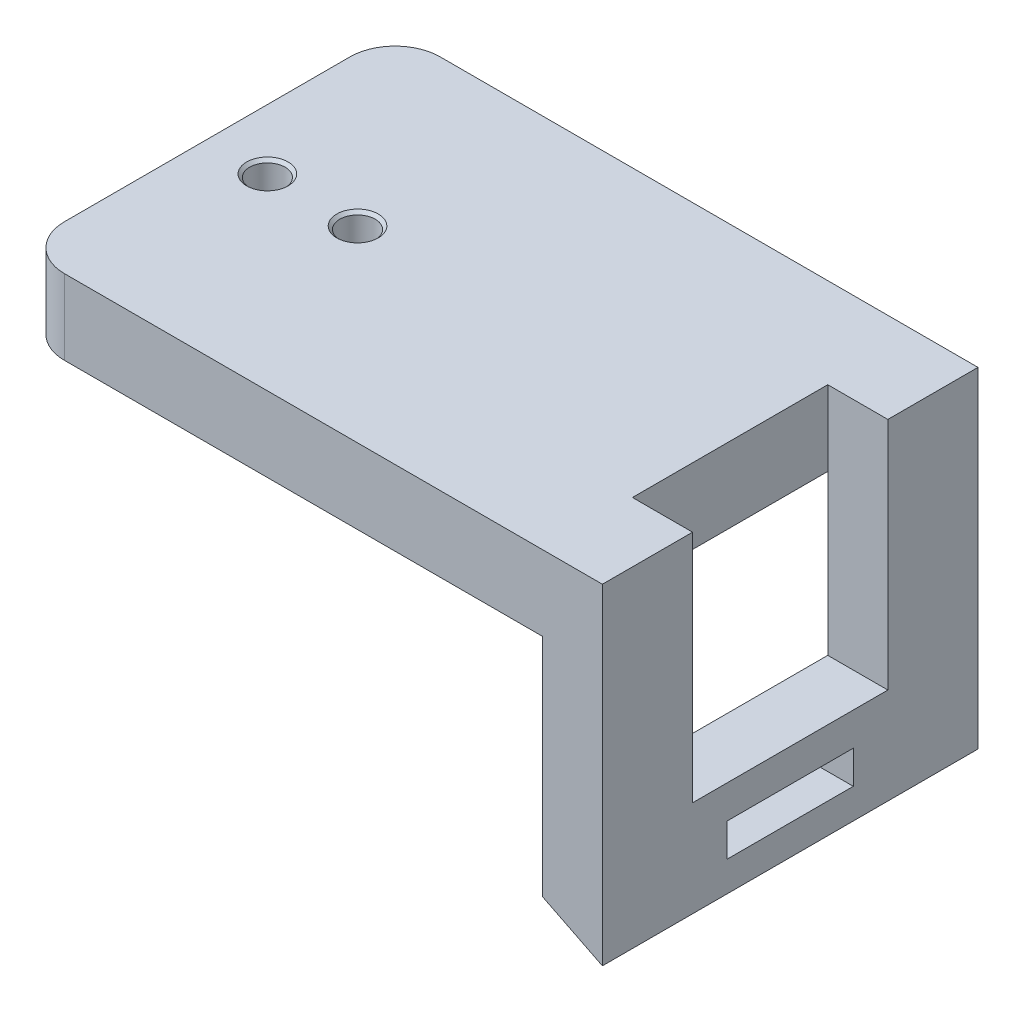
ISO-10303-21;
HEADER;
FILE_DESCRIPTION(('STEP AP214'),'2;1');
FILE_NAME('part.step','',(''),(''),'','','');
FILE_SCHEMA(('AUTOMOTIVE_DESIGN { 1 0 10303 214 1 1 1 1 }'));
ENDSEC;
DATA;
#1=APPLICATION_CONTEXT('core data for automotive mechanical design processes');
#2=APPLICATION_PROTOCOL_DEFINITION('international standard','automotive_design',2000,#1);
#3=PRODUCT_CONTEXT('',#1,'mechanical');
#4=PRODUCT('Part','Part','',(#3));
#5=PRODUCT_RELATED_PRODUCT_CATEGORY('part','',(#4));
#6=PRODUCT_DEFINITION_FORMATION('','',#4);
#7=PRODUCT_DEFINITION_CONTEXT('part definition',#1,'design');
#8=PRODUCT_DEFINITION('design','',#6,#7);
#9=PRODUCT_DEFINITION_SHAPE('','',#8);
#10=(LENGTH_UNIT() NAMED_UNIT(*) SI_UNIT(.MILLI.,.METRE.));
#11=(NAMED_UNIT(*) PLANE_ANGLE_UNIT() SI_UNIT($,.RADIAN.));
#12=(NAMED_UNIT(*) SI_UNIT($,.STERADIAN.) SOLID_ANGLE_UNIT());
#13=UNCERTAINTY_MEASURE_WITH_UNIT(LENGTH_MEASURE(1.E-05),#10,'distance_accuracy_value','');
#14=(GEOMETRIC_REPRESENTATION_CONTEXT(3) GLOBAL_UNCERTAINTY_ASSIGNED_CONTEXT((#13)) GLOBAL_UNIT_ASSIGNED_CONTEXT((#10,
#11,#12)) REPRESENTATION_CONTEXT('',''));
#15=CARTESIAN_POINT('',(0.,0.,0.));
#16=DIRECTION('',(0.,0.,1.));
#17=DIRECTION('',(1.,0.,0.));
#18=AXIS2_PLACEMENT_3D('',#15,#16,#17);
#19=CARTESIAN_POINT('',(44.196,6.35,0.));
#20=DIRECTION('',(-1.,0.,0.));
#21=DIRECTION('',(0.,0.,1.));
#22=AXIS2_PLACEMENT_3D('',#19,#20,#21);
#23=PLANE('',#22);
#24=DIRECTION('',(0.,1.,0.));
#25=VECTOR('',#24,1.);
#26=CARTESIAN_POINT('',(44.196,6.35,-7.62));
#27=LINE('',#26,#25);
#28=CARTESIAN_POINT('',(44.196,0.,-7.62));
#29=VERTEX_POINT('',#28);
#30=CARTESIAN_POINT('',(44.196,6.35,-7.62));
#31=VERTEX_POINT('',#30);
#32=EDGE_CURVE('E11',#29,#31,#27,.T.);
#33=ORIENTED_EDGE('',*,*,#32,.F.);
#34=DIRECTION('',(0.,0.,-1.));
#35=VECTOR('',#34,1.);
#36=CARTESIAN_POINT('',(44.196,0.,0.));
#37=LINE('',#36,#35);
#38=CARTESIAN_POINT('',(44.196,0.,-24.13));
#39=VERTEX_POINT('',#38);
#40=EDGE_CURVE('E298',#29,#39,#37,.T.);
#41=ORIENTED_EDGE('',*,*,#40,.T.);
#42=DIRECTION('',(0.,-1.,0.));
#43=VECTOR('',#42,1.);
#44=CARTESIAN_POINT('',(44.196,-11.43,-24.13));
#45=LINE('',#44,#43);
#46=CARTESIAN_POINT('',(44.196,6.35,-24.13));
#47=VERTEX_POINT('',#46);
#48=EDGE_CURVE('E57',#47,#39,#45,.T.);
#49=ORIENTED_EDGE('',*,*,#48,.F.);
#50=DIRECTION('',(0.,0.,-1.));
#51=VECTOR('',#50,1.);
#52=CARTESIAN_POINT('',(44.196,6.35,0.));
#53=LINE('',#52,#51);
#54=EDGE_CURVE('E263',#31,#47,#53,.T.);
#55=ORIENTED_EDGE('',*,*,#54,.F.);
#56=EDGE_LOOP('',(#33,#41,#49,#55));
#57=FACE_BOUND('',#56,.T.);
#58=ADVANCED_FACE('F33',(#57),#23,.F.);
#59=CARTESIAN_POINT('',(0.,6.35,0.));
#60=DIRECTION('',(1.,0.,0.));
#61=DIRECTION('',(0.,0.,-1.));
#62=AXIS2_PLACEMENT_3D('',#59,#60,#61);
#63=PLANE('',#62);
#64=DIRECTION('',(0.,0.,1.));
#65=VECTOR('',#64,1.);
#66=CARTESIAN_POINT('',(0.,0.,0.));
#67=LINE('',#66,#65);
#68=CARTESIAN_POINT('',(0.,0.,-27.94));
#69=VERTEX_POINT('',#68);
#70=CARTESIAN_POINT('',(0.,0.,-3.81));
#71=VERTEX_POINT('',#70);
#72=EDGE_CURVE('E302',#69,#71,#67,.T.);
#73=ORIENTED_EDGE('',*,*,#72,.T.);
#74=DIRECTION('',(0.,-1.,0.));
#75=VECTOR('',#74,1.);
#76=CARTESIAN_POINT('',(0.,6.35,-3.81));
#77=LINE('',#76,#75);
#78=CARTESIAN_POINT('',(0.,6.35,-3.81));
#79=VERTEX_POINT('',#78);
#80=EDGE_CURVE('E328',#71,#79,#77,.F.);
#81=ORIENTED_EDGE('',*,*,#80,.T.);
#82=DIRECTION('',(0.,0.,1.));
#83=VECTOR('',#82,1.);
#84=CARTESIAN_POINT('',(0.,6.35,0.));
#85=LINE('',#84,#83);
#86=CARTESIAN_POINT('',(0.,6.35,-27.94));
#87=VERTEX_POINT('',#86);
#88=EDGE_CURVE('E257',#87,#79,#85,.T.);
#89=ORIENTED_EDGE('',*,*,#88,.F.);
#90=DIRECTION('',(0.,-1.,0.));
#91=VECTOR('',#90,1.);
#92=CARTESIAN_POINT('',(0.,6.35,-27.94));
#93=LINE('',#92,#91);
#94=EDGE_CURVE('E330',#87,#69,#93,.T.);
#95=ORIENTED_EDGE('',*,*,#94,.T.);
#96=EDGE_LOOP('',(#73,#81,#89,#95));
#97=FACE_BOUND('',#96,.T.);
#98=ADVANCED_FACE('F326',(#97),#63,.F.);
#99=CARTESIAN_POINT('',(0.,6.35,0.));
#100=DIRECTION('',(0.,0.,-1.));
#101=DIRECTION('',(-1.,0.,0.));
#102=AXIS2_PLACEMENT_3D('',#99,#100,#101);
#103=PLANE('',#102);
#104=DIRECTION('',(0.,-1.,0.));
#105=VECTOR('',#104,1.);
#106=CARTESIAN_POINT('',(44.196,6.35,0.));
#107=LINE('',#106,#105);
#108=CARTESIAN_POINT('',(44.196,0.,0.));
#109=VERTEX_POINT('',#108);
#110=CARTESIAN_POINT('',(44.196,-19.05,0.));
#111=VERTEX_POINT('',#110);
#112=EDGE_CURVE('E241',#109,#111,#107,.T.);
#113=ORIENTED_EDGE('',*,*,#112,.T.);
#114=DIRECTION('',(0.894427190999916,-0.447213595499958,0.));
#115=VECTOR('',#114,1.);
#116=CARTESIAN_POINT('',(-1.3208,3.7084,0.));
#117=LINE('',#116,#115);
#118=CARTESIAN_POINT('',(49.276,-21.59,2.5E-06));
#119=VERTEX_POINT('',#118);
#120=EDGE_CURVE('E186',#111,#119,#117,.T.);
#121=ORIENTED_EDGE('',*,*,#120,.T.);
#122=DIRECTION('',(0.,-1.,0.));
#123=VECTOR('',#122,1.);
#124=CARTESIAN_POINT('',(49.276,6.35,0.));
#125=LINE('',#124,#123);
#126=CARTESIAN_POINT('',(49.276,6.35,0.));
#127=VERTEX_POINT('',#126);
#128=EDGE_CURVE('E198',#127,#119,#125,.T.);
#129=ORIENTED_EDGE('',*,*,#128,.F.);
#130=DIRECTION('',(1.,0.,0.));
#131=VECTOR('',#130,1.);
#132=CARTESIAN_POINT('',(0.,6.35,0.));
#133=LINE('',#132,#131);
#134=CARTESIAN_POINT('',(3.81,6.35,0.));
#135=VERTEX_POINT('',#134);
#136=EDGE_CURVE('E260',#135,#127,#133,.T.);
#137=ORIENTED_EDGE('',*,*,#136,.F.);
#138=DIRECTION('',(0.,-1.,0.));
#139=VECTOR('',#138,1.);
#140=CARTESIAN_POINT('',(3.81,6.35,0.));
#141=LINE('',#140,#139);
#142=CARTESIAN_POINT('',(3.81,0.,0.));
#143=VERTEX_POINT('',#142);
#144=EDGE_CURVE('E348',#135,#143,#141,.T.);
#145=ORIENTED_EDGE('',*,*,#144,.T.);
#146=DIRECTION('',(1.,0.,0.));
#147=VECTOR('',#146,1.);
#148=CARTESIAN_POINT('',(0.,0.,0.));
#149=LINE('',#148,#147);
#150=EDGE_CURVE('E299',#143,#109,#149,.T.);
#151=ORIENTED_EDGE('',*,*,#150,.T.);
#152=EDGE_LOOP('',(#113,#121,#129,#137,#145,#151));
#153=FACE_BOUND('',#152,.T.);
#154=ADVANCED_FACE('F399',(#153),#103,.F.);
#155=CARTESIAN_POINT('',(0.,6.35,-31.75));
#156=DIRECTION('',(0.,0.,1.));
#157=DIRECTION('',(1.,0.,0.));
#158=AXIS2_PLACEMENT_3D('',#155,#156,#157);
#159=PLANE('',#158);
#160=DIRECTION('',(0.,1.,0.));
#161=VECTOR('',#160,1.);
#162=CARTESIAN_POINT('',(49.276,6.35,-31.75));
#163=LINE('',#162,#161);
#164=CARTESIAN_POINT('',(49.276,-21.59,-31.75));
#165=VERTEX_POINT('',#164);
#166=CARTESIAN_POINT('',(49.276,6.35,-31.75));
#167=VERTEX_POINT('',#166);
#168=EDGE_CURVE('E201',#165,#167,#163,.T.);
#169=ORIENTED_EDGE('',*,*,#168,.F.);
#170=DIRECTION('',(0.894427190999916,-0.447213595499958,0.));
#171=VECTOR('',#170,1.);
#172=CARTESIAN_POINT('',(49.276,-21.59,-31.75));
#173=LINE('',#172,#171);
#174=CARTESIAN_POINT('',(44.196,-19.05,-31.75));
#175=VERTEX_POINT('',#174);
#176=EDGE_CURVE('E181',#175,#165,#173,.T.);
#177=ORIENTED_EDGE('',*,*,#176,.F.);
#178=DIRECTION('',(0.,1.,0.));
#179=VECTOR('',#178,1.);
#180=CARTESIAN_POINT('',(44.196,6.35,-31.75));
#181=LINE('',#180,#179);
#182=CARTESIAN_POINT('',(44.196,0.,-31.75));
#183=VERTEX_POINT('',#182);
#184=EDGE_CURVE('E195',#175,#183,#181,.T.);
#185=ORIENTED_EDGE('',*,*,#184,.T.);
#186=DIRECTION('',(-1.,0.,0.));
#187=VECTOR('',#186,1.);
#188=CARTESIAN_POINT('',(0.,0.,-31.75));
#189=LINE('',#188,#187);
#190=CARTESIAN_POINT('',(3.81,0.,-31.75));
#191=VERTEX_POINT('',#190);
#192=EDGE_CURVE('E261',#183,#191,#189,.T.);
#193=ORIENTED_EDGE('',*,*,#192,.T.);
#194=DIRECTION('',(0.,-1.,0.));
#195=VECTOR('',#194,1.);
#196=CARTESIAN_POINT('',(3.81,6.35,-31.75));
#197=LINE('',#196,#195);
#198=CARTESIAN_POINT('',(3.81,6.35,-31.75));
#199=VERTEX_POINT('',#198);
#200=EDGE_CURVE('E42',#191,#199,#197,.F.);
#201=ORIENTED_EDGE('',*,*,#200,.T.);
#202=DIRECTION('',(-1.,0.,0.));
#203=VECTOR('',#202,1.);
#204=CARTESIAN_POINT('',(0.,6.35,-31.75));
#205=LINE('',#204,#203);
#206=EDGE_CURVE('E266',#167,#199,#205,.T.);
#207=ORIENTED_EDGE('',*,*,#206,.F.);
#208=EDGE_LOOP('',(#169,#177,#185,#193,#201,#207));
#209=FACE_BOUND('',#208,.T.);
#210=ADVANCED_FACE('F282',(#209),#159,.F.);
#211=CARTESIAN_POINT('',(0.,6.35,0.));
#212=DIRECTION('',(0.,-1.,0.));
#213=DIRECTION('',(0.,0.,-1.));
#214=AXIS2_PLACEMENT_3D('',#211,#212,#213);
#215=PLANE('',#214);
#216=CARTESIAN_POINT('',(12.7,6.35,-15.875));
#217=DIRECTION('',(0.,-1.,0.));
#218=DIRECTION('',(0.,0.,-1.));
#219=AXIS2_PLACEMENT_3D('',#216,#217,#218);
#220=CIRCLE('',#219,1.75399999999999);
#221=CARTESIAN_POINT('',(12.7,6.35,-17.629));
#222=VERTEX_POINT('',#221);
#223=EDGE_CURVE('E350',#222,#222,#220,.T.);
#224=ORIENTED_EDGE('',*,*,#223,.T.);
#225=EDGE_LOOP('',(#224));
#226=FACE_BOUND('',#225,.T.);
#227=CARTESIAN_POINT('',(5.08,6.35,-15.875));
#228=DIRECTION('',(0.,-1.,0.));
#229=DIRECTION('',(0.,0.,-1.));
#230=AXIS2_PLACEMENT_3D('',#227,#228,#229);
#231=CIRCLE('',#230,1.754);
#232=CARTESIAN_POINT('',(5.08,6.35,-17.629));
#233=VERTEX_POINT('',#232);
#234=EDGE_CURVE('E355',#233,#233,#231,.T.);
#235=ORIENTED_EDGE('',*,*,#234,.T.);
#236=EDGE_LOOP('',(#235));
#237=FACE_BOUND('',#236,.T.);
#238=ORIENTED_EDGE('',*,*,#88,.T.);
#239=CARTESIAN_POINT('',(3.81,6.35,-3.81));
#240=DIRECTION('',(0.,-1.,0.));
#241=DIRECTION('',(0.,0.,-1.));
#242=AXIS2_PLACEMENT_3D('',#239,#240,#241);
#243=CIRCLE('',#242,3.81);
#244=EDGE_CURVE('E337',#79,#135,#243,.F.);
#245=ORIENTED_EDGE('',*,*,#244,.T.);
#246=ORIENTED_EDGE('',*,*,#136,.T.);
#247=DIRECTION('',(0.,0.,1.));
#248=VECTOR('',#247,1.);
#249=CARTESIAN_POINT('',(49.276,6.35,0.));
#250=LINE('',#249,#248);
#251=CARTESIAN_POINT('',(49.276,6.35,-7.62));
#252=VERTEX_POINT('',#251);
#253=EDGE_CURVE('E202',#252,#127,#250,.T.);
#254=ORIENTED_EDGE('',*,*,#253,.F.);
#255=DIRECTION('',(-1.,0.,0.));
#256=VECTOR('',#255,1.);
#257=CARTESIAN_POINT('',(49.276,6.35,-7.62));
#258=LINE('',#257,#256);
#259=EDGE_CURVE('E248',#252,#31,#258,.T.);
#260=ORIENTED_EDGE('',*,*,#259,.T.);
#261=ORIENTED_EDGE('',*,*,#54,.T.);
#262=DIRECTION('',(-1.,0.,0.));
#263=VECTOR('',#262,1.);
#264=CARTESIAN_POINT('',(49.276,6.35,-24.13));
#265=LINE('',#264,#263);
#266=CARTESIAN_POINT('',(49.276,6.35,-24.13));
#267=VERTEX_POINT('',#266);
#268=EDGE_CURVE('E273',#267,#47,#265,.T.);
#269=ORIENTED_EDGE('',*,*,#268,.F.);
#270=DIRECTION('',(0.,0.,1.));
#271=VECTOR('',#270,1.);
#272=CARTESIAN_POINT('',(49.276,6.35,-24.13));
#273=LINE('',#272,#271);
#274=EDGE_CURVE('E161',#167,#267,#273,.T.);
#275=ORIENTED_EDGE('',*,*,#274,.F.);
#276=ORIENTED_EDGE('',*,*,#206,.T.);
#277=CARTESIAN_POINT('',(3.81,6.35,-27.94));
#278=DIRECTION('',(0.,-1.,0.));
#279=DIRECTION('',(0.,0.,-1.));
#280=AXIS2_PLACEMENT_3D('',#277,#278,#279);
#281=CIRCLE('',#280,3.81);
#282=EDGE_CURVE('E338',#199,#87,#281,.F.);
#283=ORIENTED_EDGE('',*,*,#282,.T.);
#284=EDGE_LOOP('',(#238,#245,#246,#254,#260,#261,#269,#275,#276,#283));
#285=FACE_BOUND('',#284,.T.);
#286=ADVANCED_FACE('F347',(#226,#237,#285),#215,.F.);
#287=CARTESIAN_POINT('',(0.,0.,0.));
#288=DIRECTION('',(0.,-1.,0.));
#289=DIRECTION('',(0.,0.,-1.));
#290=AXIS2_PLACEMENT_3D('',#287,#288,#289);
#291=PLANE('',#290);
#292=CARTESIAN_POINT('',(5.08,0.,-15.875));
#293=DIRECTION('',(0.,-1.,0.));
#294=DIRECTION('',(0.,0.,-1.));
#295=AXIS2_PLACEMENT_3D('',#292,#293,#294);
#296=CIRCLE('',#295,1.754);
#297=CARTESIAN_POINT('',(5.08,0.,-17.629));
#298=VERTEX_POINT('',#297);
#299=EDGE_CURVE('E369',#298,#298,#296,.F.);
#300=ORIENTED_EDGE('',*,*,#299,.T.);
#301=EDGE_LOOP('',(#300));
#302=FACE_BOUND('',#301,.T.);
#303=CARTESIAN_POINT('',(12.7,0.,-15.875));
#304=DIRECTION('',(0.,-1.,0.));
#305=DIRECTION('',(0.,0.,-1.));
#306=AXIS2_PLACEMENT_3D('',#303,#304,#305);
#307=CIRCLE('',#306,1.754);
#308=CARTESIAN_POINT('',(12.7,0.,-17.629));
#309=VERTEX_POINT('',#308);
#310=EDGE_CURVE('E308',#309,#309,#307,.F.);
#311=ORIENTED_EDGE('',*,*,#310,.T.);
#312=EDGE_LOOP('',(#311));
#313=FACE_BOUND('',#312,.T.);
#314=ORIENTED_EDGE('',*,*,#150,.F.);
#315=CARTESIAN_POINT('',(3.81,0.,-3.81));
#316=DIRECTION('',(0.,-1.,0.));
#317=DIRECTION('',(0.,0.,-1.));
#318=AXIS2_PLACEMENT_3D('',#315,#316,#317);
#319=CIRCLE('',#318,3.81);
#320=EDGE_CURVE('E335',#143,#71,#319,.T.);
#321=ORIENTED_EDGE('',*,*,#320,.T.);
#322=ORIENTED_EDGE('',*,*,#72,.F.);
#323=CARTESIAN_POINT('',(3.81,0.,-27.94));
#324=DIRECTION('',(0.,-1.,0.));
#325=DIRECTION('',(0.,0.,-1.));
#326=AXIS2_PLACEMENT_3D('',#323,#324,#325);
#327=CIRCLE('',#326,3.81);
#328=EDGE_CURVE('E294',#69,#191,#327,.T.);
#329=ORIENTED_EDGE('',*,*,#328,.T.);
#330=ORIENTED_EDGE('',*,*,#192,.F.);
#331=EDGE_CURVE('E292',#39,#183,#37,.T.);
#332=ORIENTED_EDGE('',*,*,#331,.F.);
#333=ORIENTED_EDGE('',*,*,#40,.F.);
#334=EDGE_CURVE('E295',#109,#29,#37,.T.);
#335=ORIENTED_EDGE('',*,*,#334,.F.);
#336=EDGE_LOOP('',(#314,#321,#322,#329,#330,#332,#333,#335));
#337=FACE_BOUND('',#336,.T.);
#338=ADVANCED_FACE('F290',(#302,#313,#337),#291,.T.);
#339=CARTESIAN_POINT('',(12.7,6.35,-15.875));
#340=DIRECTION('',(0.,1.,0.));
#341=DIRECTION('',(0.,0.,1.));
#342=AXIS2_PLACEMENT_3D('',#339,#340,#341);
#343=CYLINDRICAL_SURFACE('',#342,1.49999999999999);
#344=CARTESIAN_POINT('',(12.7,0.254000000000004,-15.875));
#345=DIRECTION('',(0.,-1.,0.));
#346=DIRECTION('',(0.,0.,-1.));
#347=AXIS2_PLACEMENT_3D('',#344,#345,#346);
#348=CIRCLE('',#347,1.49999999999999);
#349=CARTESIAN_POINT('',(12.7,0.254000000000004,-17.375));
#350=VERTEX_POINT('',#349);
#351=EDGE_CURVE('E358',#350,#350,#348,.T.);
#352=ORIENTED_EDGE('',*,*,#351,.T.);
#353=EDGE_LOOP('',(#352));
#354=FACE_BOUND('',#353,.T.);
#355=CARTESIAN_POINT('',(12.7,6.096,-15.875));
#356=DIRECTION('',(0.,-1.,0.));
#357=DIRECTION('',(0.,0.,-1.));
#358=AXIS2_PLACEMENT_3D('',#355,#356,#357);
#359=CIRCLE('',#358,1.49999999999999);
#360=CARTESIAN_POINT('',(12.7,6.096,-17.375));
#361=VERTEX_POINT('',#360);
#362=EDGE_CURVE('E361',#361,#361,#359,.F.);
#363=ORIENTED_EDGE('',*,*,#362,.T.);
#364=EDGE_LOOP('',(#363));
#365=FACE_BOUND('',#364,.T.);
#366=ADVANCED_FACE('F444',(#354,#365),#343,.F.);
#367=CARTESIAN_POINT('',(5.08,6.35,-15.875));
#368=DIRECTION('',(0.,1.,0.));
#369=DIRECTION('',(0.,0.,1.));
#370=AXIS2_PLACEMENT_3D('',#367,#368,#369);
#371=CYLINDRICAL_SURFACE('',#370,1.49999999999999);
#372=CARTESIAN_POINT('',(5.08,0.254000000000004,-15.875));
#373=DIRECTION('',(0.,-1.,0.));
#374=DIRECTION('',(0.,0.,-1.));
#375=AXIS2_PLACEMENT_3D('',#372,#373,#374);
#376=CIRCLE('',#375,1.49999999999999);
#377=CARTESIAN_POINT('',(5.08,0.254000000000004,-17.375));
#378=VERTEX_POINT('',#377);
#379=EDGE_CURVE('E364',#378,#378,#376,.T.);
#380=ORIENTED_EDGE('',*,*,#379,.T.);
#381=EDGE_LOOP('',(#380));
#382=FACE_BOUND('',#381,.T.);
#383=CARTESIAN_POINT('',(5.08,6.096,-15.875));
#384=DIRECTION('',(0.,-1.,0.));
#385=DIRECTION('',(0.,0.,-1.));
#386=AXIS2_PLACEMENT_3D('',#383,#384,#385);
#387=CIRCLE('',#386,1.49999999999999);
#388=CARTESIAN_POINT('',(5.08,6.096,-17.375));
#389=VERTEX_POINT('',#388);
#390=EDGE_CURVE('E367',#389,#389,#387,.F.);
#391=ORIENTED_EDGE('',*,*,#390,.T.);
#392=EDGE_LOOP('',(#391));
#393=FACE_BOUND('',#392,.T.);
#394=ADVANCED_FACE('F390',(#382,#393),#371,.F.);
#395=CARTESIAN_POINT('',(5.08,0.,-15.875));
#396=DIRECTION('',(0.,-1.,0.));
#397=DIRECTION('',(0.,0.,-1.));
#398=AXIS2_PLACEMENT_3D('',#395,#396,#397);
#399=CONICAL_SURFACE('',#398,1.754,0.785398163397444);
#400=ORIENTED_EDGE('',*,*,#379,.F.);
#401=EDGE_LOOP('',(#400));
#402=FACE_BOUND('',#401,.T.);
#403=ORIENTED_EDGE('',*,*,#299,.F.);
#404=EDGE_LOOP('',(#403));
#405=FACE_BOUND('',#404,.T.);
#406=ADVANCED_FACE('F380',(#402,#405),#399,.F.);
#407=CARTESIAN_POINT('',(12.7,0.,-15.875));
#408=DIRECTION('',(0.,-1.,0.));
#409=DIRECTION('',(0.,0.,-1.));
#410=AXIS2_PLACEMENT_3D('',#407,#408,#409);
#411=CONICAL_SURFACE('',#410,1.754,0.785398163397445);
#412=ORIENTED_EDGE('',*,*,#351,.F.);
#413=EDGE_LOOP('',(#412));
#414=FACE_BOUND('',#413,.T.);
#415=ORIENTED_EDGE('',*,*,#310,.F.);
#416=EDGE_LOOP('',(#415));
#417=FACE_BOUND('',#416,.T.);
#418=ADVANCED_FACE('F377',(#414,#417),#411,.F.);
#419=CARTESIAN_POINT('',(12.7,6.096,-15.875));
#420=DIRECTION('',(0.,1.,0.));
#421=DIRECTION('',(0.,0.,1.));
#422=AXIS2_PLACEMENT_3D('',#419,#420,#421);
#423=CONICAL_SURFACE('',#422,1.49999999999999,0.785398163397452);
#424=ORIENTED_EDGE('',*,*,#223,.F.);
#425=EDGE_LOOP('',(#424));
#426=FACE_BOUND('',#425,.T.);
#427=ORIENTED_EDGE('',*,*,#362,.F.);
#428=EDGE_LOOP('',(#427));
#429=FACE_BOUND('',#428,.T.);
#430=ADVANCED_FACE('F379',(#426,#429),#423,.F.);
#431=CARTESIAN_POINT('',(5.08,6.096,-15.875));
#432=DIRECTION('',(0.,1.,0.));
#433=DIRECTION('',(0.,0.,1.));
#434=AXIS2_PLACEMENT_3D('',#431,#432,#433);
#435=CONICAL_SURFACE('',#434,1.49999999999999,0.785398163397451);
#436=ORIENTED_EDGE('',*,*,#234,.F.);
#437=EDGE_LOOP('',(#436));
#438=FACE_BOUND('',#437,.T.);
#439=ORIENTED_EDGE('',*,*,#390,.F.);
#440=EDGE_LOOP('',(#439));
#441=FACE_BOUND('',#440,.T.);
#442=ADVANCED_FACE('F387',(#438,#441),#435,.F.);
#443=CARTESIAN_POINT('',(3.81,6.35,-3.81));
#444=DIRECTION('',(0.,-1.,0.));
#445=DIRECTION('',(0.,0.,-1.));
#446=AXIS2_PLACEMENT_3D('',#443,#444,#445);
#447=CYLINDRICAL_SURFACE('',#446,3.81);
#448=ORIENTED_EDGE('',*,*,#244,.F.);
#449=ORIENTED_EDGE('',*,*,#80,.F.);
#450=ORIENTED_EDGE('',*,*,#320,.F.);
#451=ORIENTED_EDGE('',*,*,#144,.F.);
#452=EDGE_LOOP('',(#448,#449,#450,#451));
#453=FACE_BOUND('',#452,.T.);
#454=ADVANCED_FACE('F333',(#453),#447,.T.);
#455=CARTESIAN_POINT('',(3.81,6.35,-27.94));
#456=DIRECTION('',(0.,-1.,0.));
#457=DIRECTION('',(0.,0.,-1.));
#458=AXIS2_PLACEMENT_3D('',#455,#456,#457);
#459=CYLINDRICAL_SURFACE('',#458,3.81);
#460=ORIENTED_EDGE('',*,*,#282,.F.);
#461=ORIENTED_EDGE('',*,*,#200,.F.);
#462=ORIENTED_EDGE('',*,*,#328,.F.);
#463=ORIENTED_EDGE('',*,*,#94,.F.);
#464=EDGE_LOOP('',(#460,#461,#462,#463));
#465=FACE_BOUND('',#464,.T.);
#466=ADVANCED_FACE('F35',(#465),#459,.T.);
#467=CARTESIAN_POINT('',(49.276,-11.43,-24.13));
#468=DIRECTION('',(0.,0.,-1.));
#469=DIRECTION('',(-1.,0.,0.));
#470=AXIS2_PLACEMENT_3D('',#467,#468,#469);
#471=PLANE('',#470);
#472=ORIENTED_EDGE('',*,*,#48,.T.);
#473=CARTESIAN_POINT('',(44.196,-13.462,-24.13));
#474=VERTEX_POINT('',#473);
#475=EDGE_CURVE('E50',#39,#474,#45,.T.);
#476=ORIENTED_EDGE('',*,*,#475,.T.);
#477=DIRECTION('',(-1.,0.,0.));
#478=VECTOR('',#477,1.);
#479=CARTESIAN_POINT('',(49.276,-13.462,-24.13));
#480=LINE('',#479,#478);
#481=CARTESIAN_POINT('',(49.276,-13.462,-24.13));
#482=VERTEX_POINT('',#481);
#483=EDGE_CURVE('E166',#482,#474,#480,.T.);
#484=ORIENTED_EDGE('',*,*,#483,.F.);
#485=DIRECTION('',(0.,-1.,0.));
#486=VECTOR('',#485,1.);
#487=CARTESIAN_POINT('',(49.276,-11.43,-24.13));
#488=LINE('',#487,#486);
#489=EDGE_CURVE('E155',#267,#482,#488,.T.);
#490=ORIENTED_EDGE('',*,*,#489,.F.);
#491=ORIENTED_EDGE('',*,*,#268,.T.);
#492=EDGE_LOOP('',(#472,#476,#484,#490,#491));
#493=FACE_BOUND('',#492,.T.);
#494=ADVANCED_FACE('F167',(#493),#471,.F.);
#495=CARTESIAN_POINT('',(49.276,6.35,-7.62));
#496=DIRECTION('',(0.,0.,1.));
#497=DIRECTION('',(0.,-1.,0.));
#498=AXIS2_PLACEMENT_3D('',#495,#496,#497);
#499=PLANE('',#498);
#500=CARTESIAN_POINT('',(44.196,-13.462,-7.62));
#501=VERTEX_POINT('',#500);
#502=EDGE_CURVE('E244',#501,#29,#27,.T.);
#503=ORIENTED_EDGE('',*,*,#502,.T.);
#504=ORIENTED_EDGE('',*,*,#32,.T.);
#505=ORIENTED_EDGE('',*,*,#259,.F.);
#506=DIRECTION('',(0.,1.,0.));
#507=VECTOR('',#506,1.);
#508=CARTESIAN_POINT('',(49.276,6.35,-7.62));
#509=LINE('',#508,#507);
#510=CARTESIAN_POINT('',(49.276,-13.462,-7.62));
#511=VERTEX_POINT('',#510);
#512=EDGE_CURVE('E164',#511,#252,#509,.T.);
#513=ORIENTED_EDGE('',*,*,#512,.F.);
#514=DIRECTION('',(1.,0.,0.));
#515=VECTOR('',#514,1.);
#516=CARTESIAN_POINT('',(49.276,-13.462,-7.62));
#517=LINE('',#516,#515);
#518=EDGE_CURVE('E176',#501,#511,#517,.T.);
#519=ORIENTED_EDGE('',*,*,#518,.F.);
#520=EDGE_LOOP('',(#503,#504,#505,#513,#519));
#521=FACE_BOUND('',#520,.T.);
#522=ADVANCED_FACE('F430',(#521),#499,.F.);
#523=CARTESIAN_POINT('',(49.276,0.,0.));
#524=DIRECTION('',(-1.,0.,0.));
#525=DIRECTION('',(0.,0.,1.));
#526=AXIS2_PLACEMENT_3D('',#523,#524,#525);
#527=PLANE('',#526);
#528=DIRECTION('',(0.,0.,1.));
#529=VECTOR('',#528,1.);
#530=CARTESIAN_POINT('',(49.276,-19.05,-31.75));
#531=LINE('',#530,#529);
#532=CARTESIAN_POINT('',(49.276,-19.05,-21.209));
#533=VERTEX_POINT('',#532);
#534=CARTESIAN_POINT('',(49.276,-19.05,-10.541));
#535=VERTEX_POINT('',#534);
#536=EDGE_CURVE('E206',#533,#535,#531,.T.);
#537=ORIENTED_EDGE('',*,*,#536,.T.);
#538=DIRECTION('',(0.,1.,0.));
#539=VECTOR('',#538,1.);
#540=CARTESIAN_POINT('',(49.276,0.,-10.541));
#541=LINE('',#540,#539);
#542=CARTESIAN_POINT('',(49.276,-16.256,-10.541));
#543=VERTEX_POINT('',#542);
#544=EDGE_CURVE('E227',#535,#543,#541,.T.);
#545=ORIENTED_EDGE('',*,*,#544,.T.);
#546=DIRECTION('',(0.,0.,-1.));
#547=VECTOR('',#546,1.);
#548=CARTESIAN_POINT('',(49.276,-16.256,0.));
#549=LINE('',#548,#547);
#550=CARTESIAN_POINT('',(49.276,-16.256,-21.209));
#551=VERTEX_POINT('',#550);
#552=EDGE_CURVE('E236',#543,#551,#549,.T.);
#553=ORIENTED_EDGE('',*,*,#552,.T.);
#554=DIRECTION('',(0.,-1.,0.));
#555=VECTOR('',#554,1.);
#556=CARTESIAN_POINT('',(49.276,0.,-21.209));
#557=LINE('',#556,#555);
#558=EDGE_CURVE('E239',#551,#533,#557,.T.);
#559=ORIENTED_EDGE('',*,*,#558,.T.);
#560=EDGE_LOOP('',(#537,#545,#553,#559));
#561=FACE_BOUND('',#560,.T.);
#562=DIRECTION('',(0.,0.,-1.));
#563=VECTOR('',#562,1.);
#564=CARTESIAN_POINT('',(49.276,-13.462,-7.62));
#565=LINE('',#564,#563);
#566=EDGE_CURVE('E158',#511,#482,#565,.T.);
#567=ORIENTED_EDGE('',*,*,#566,.F.);
#568=ORIENTED_EDGE('',*,*,#512,.T.);
#569=ORIENTED_EDGE('',*,*,#253,.T.);
#570=ORIENTED_EDGE('',*,*,#128,.T.);
#571=DIRECTION('',(0.,0.,1.));
#572=VECTOR('',#571,1.);
#573=CARTESIAN_POINT('',(49.276,-21.59,-31.75));
#574=LINE('',#573,#572);
#575=EDGE_CURVE('E204',#165,#119,#574,.T.);
#576=ORIENTED_EDGE('',*,*,#575,.F.);
#577=ORIENTED_EDGE('',*,*,#168,.T.);
#578=ORIENTED_EDGE('',*,*,#274,.T.);
#579=ORIENTED_EDGE('',*,*,#489,.T.);
#580=EDGE_LOOP('',(#567,#568,#569,#570,#576,#577,#578,#579));
#581=FACE_BOUND('',#580,.T.);
#582=ADVANCED_FACE('F156',(#561,#581),#527,.F.);
#583=CARTESIAN_POINT('',(44.196,0.,0.));
#584=DIRECTION('',(-1.,0.,0.));
#585=DIRECTION('',(0.,0.,1.));
#586=AXIS2_PLACEMENT_3D('',#583,#584,#585);
#587=PLANE('',#586);
#588=ORIENTED_EDGE('',*,*,#502,.F.);
#589=DIRECTION('',(0.,0.,1.));
#590=VECTOR('',#589,1.);
#591=CARTESIAN_POINT('',(44.196,-13.462,-7.62));
#592=LINE('',#591,#590);
#593=EDGE_CURVE('E171',#474,#501,#592,.T.);
#594=ORIENTED_EDGE('',*,*,#593,.F.);
#595=ORIENTED_EDGE('',*,*,#475,.F.);
#596=ORIENTED_EDGE('',*,*,#331,.T.);
#597=ORIENTED_EDGE('',*,*,#184,.F.);
#598=DIRECTION('',(0.,0.,-1.));
#599=VECTOR('',#598,1.);
#600=CARTESIAN_POINT('',(44.196,-19.05,5.00000000014378E-05));
#601=LINE('',#600,#599);
#602=CARTESIAN_POINT('',(44.196,-19.05,-21.209));
#603=VERTEX_POINT('',#602);
#604=EDGE_CURVE('E183',#603,#175,#601,.T.);
#605=ORIENTED_EDGE('',*,*,#604,.F.);
#606=DIRECTION('',(0.,-1.,0.));
#607=VECTOR('',#606,1.);
#608=CARTESIAN_POINT('',(44.196,-19.05,-21.209));
#609=LINE('',#608,#607);
#610=CARTESIAN_POINT('',(44.196,-16.256,-21.209));
#611=VERTEX_POINT('',#610);
#612=EDGE_CURVE('E205',#611,#603,#609,.T.);
#613=ORIENTED_EDGE('',*,*,#612,.F.);
#614=DIRECTION('',(0.,0.,-1.));
#615=VECTOR('',#614,1.);
#616=CARTESIAN_POINT('',(44.196,-16.256,-21.209));
#617=LINE('',#616,#615);
#618=CARTESIAN_POINT('',(44.196,-16.256,-10.541));
#619=VERTEX_POINT('',#618);
#620=EDGE_CURVE('E221',#619,#611,#617,.T.);
#621=ORIENTED_EDGE('',*,*,#620,.F.);
#622=DIRECTION('',(0.,1.,0.));
#623=VECTOR('',#622,1.);
#624=CARTESIAN_POINT('',(44.196,-19.05,-10.541));
#625=LINE('',#624,#623);
#626=CARTESIAN_POINT('',(44.196,-19.05,-10.541));
#627=VERTEX_POINT('',#626);
#628=EDGE_CURVE('E210',#627,#619,#625,.T.);
#629=ORIENTED_EDGE('',*,*,#628,.F.);
#630=EDGE_CURVE('E185',#111,#627,#601,.T.);
#631=ORIENTED_EDGE('',*,*,#630,.F.);
#632=ORIENTED_EDGE('',*,*,#112,.F.);
#633=ORIENTED_EDGE('',*,*,#334,.T.);
#634=EDGE_LOOP('',(#588,#594,#595,#596,#597,#605,#613,#621,#629,#631,#632,#633));
#635=FACE_BOUND('',#634,.T.);
#636=ADVANCED_FACE('F297',(#635),#587,.T.);
#637=CARTESIAN_POINT('',(49.276025,-19.05,-21.209));
#638=DIRECTION('',(0.,0.,-1.));
#639=DIRECTION('',(0.,1.,0.));
#640=AXIS2_PLACEMENT_3D('',#637,#638,#639);
#641=PLANE('',#640);
#642=DIRECTION('',(-1.,0.,0.));
#643=VECTOR('',#642,1.);
#644=CARTESIAN_POINT('',(49.276025,-16.256,-21.209));
#645=LINE('',#644,#643);
#646=EDGE_CURVE('E225',#551,#611,#645,.T.);
#647=ORIENTED_EDGE('',*,*,#646,.T.);
#648=ORIENTED_EDGE('',*,*,#612,.T.);
#649=DIRECTION('',(-1.,0.,0.));
#650=VECTOR('',#649,1.);
#651=CARTESIAN_POINT('',(49.276025,-19.05,-21.209));
#652=LINE('',#651,#650);
#653=EDGE_CURVE('E224',#533,#603,#652,.T.);
#654=ORIENTED_EDGE('',*,*,#653,.F.);
#655=ORIENTED_EDGE('',*,*,#558,.F.);
#656=EDGE_LOOP('',(#647,#648,#654,#655));
#657=FACE_BOUND('',#656,.T.);
#658=ADVANCED_FACE('F428',(#657),#641,.F.);
#659=CARTESIAN_POINT('',(49.276025,-16.256,-21.209));
#660=DIRECTION('',(0.,1.,0.));
#661=DIRECTION('',(0.,0.,1.));
#662=AXIS2_PLACEMENT_3D('',#659,#660,#661);
#663=PLANE('',#662);
#664=DIRECTION('',(-1.,0.,0.));
#665=VECTOR('',#664,1.);
#666=CARTESIAN_POINT('',(49.276025,-16.256,-10.541));
#667=LINE('',#666,#665);
#668=EDGE_CURVE('E228',#543,#619,#667,.T.);
#669=ORIENTED_EDGE('',*,*,#668,.T.);
#670=ORIENTED_EDGE('',*,*,#620,.T.);
#671=ORIENTED_EDGE('',*,*,#646,.F.);
#672=ORIENTED_EDGE('',*,*,#552,.F.);
#673=EDGE_LOOP('',(#669,#670,#671,#672));
#674=FACE_BOUND('',#673,.T.);
#675=ADVANCED_FACE('F425',(#674),#663,.F.);
#676=CARTESIAN_POINT('',(49.276025,-19.05,-10.541));
#677=DIRECTION('',(0.,0.,1.));
#678=DIRECTION('',(0.,-1.,0.));
#679=AXIS2_PLACEMENT_3D('',#676,#677,#678);
#680=PLANE('',#679);
#681=DIRECTION('',(-1.,0.,0.));
#682=VECTOR('',#681,1.);
#683=CARTESIAN_POINT('',(49.276025,-19.05,-10.541));
#684=LINE('',#683,#682);
#685=EDGE_CURVE('E230',#535,#627,#684,.T.);
#686=ORIENTED_EDGE('',*,*,#685,.T.);
#687=ORIENTED_EDGE('',*,*,#628,.T.);
#688=ORIENTED_EDGE('',*,*,#668,.F.);
#689=ORIENTED_EDGE('',*,*,#544,.F.);
#690=EDGE_LOOP('',(#686,#687,#688,#689));
#691=FACE_BOUND('',#690,.T.);
#692=ADVANCED_FACE('F421',(#691),#680,.F.);
#693=CARTESIAN_POINT('',(0.,-19.05,0.));
#694=DIRECTION('',(0.,1.,0.));
#695=DIRECTION('',(0.,0.,1.));
#696=AXIS2_PLACEMENT_3D('',#693,#694,#695);
#697=PLANE('',#696);
#698=ORIENTED_EDGE('',*,*,#653,.T.);
#699=DIRECTION('',(0.,0.,-1.));
#700=VECTOR('',#699,1.);
#701=CARTESIAN_POINT('',(44.196,-19.05,-31.75));
#702=LINE('',#701,#700);
#703=EDGE_CURVE('E190',#627,#603,#702,.T.);
#704=ORIENTED_EDGE('',*,*,#703,.F.);
#705=ORIENTED_EDGE('',*,*,#685,.F.);
#706=ORIENTED_EDGE('',*,*,#536,.F.);
#707=EDGE_LOOP('',(#698,#704,#705,#706));
#708=FACE_BOUND('',#707,.T.);
#709=ADVANCED_FACE('F419',(#708),#697,.T.);
#710=CARTESIAN_POINT('',(49.276,-21.59,5.00000000014378E-05));
#711=DIRECTION('',(0.447213595499958,0.894427190999916,0.));
#712=DIRECTION('',(-0.894427190999916,0.447213595499958,0.));
#713=AXIS2_PLACEMENT_3D('',#710,#711,#712);
#714=PLANE('',#713);
#715=ORIENTED_EDGE('',*,*,#630,.T.);
#716=ORIENTED_EDGE('',*,*,#703,.T.);
#717=ORIENTED_EDGE('',*,*,#604,.T.);
#718=ORIENTED_EDGE('',*,*,#176,.T.);
#719=ORIENTED_EDGE('',*,*,#575,.T.);
#720=ORIENTED_EDGE('',*,*,#120,.F.);
#721=EDGE_LOOP('',(#715,#716,#717,#718,#719,#720));
#722=FACE_BOUND('',#721,.T.);
#723=ADVANCED_FACE('F417',(#722),#714,.F.);
#724=CARTESIAN_POINT('',(0.,-13.462,0.));
#725=DIRECTION('',(0.,1.,0.));
#726=DIRECTION('',(0.,0.,1.));
#727=AXIS2_PLACEMENT_3D('',#724,#725,#726);
#728=PLANE('',#727);
#729=ORIENTED_EDGE('',*,*,#566,.T.);
#730=ORIENTED_EDGE('',*,*,#483,.T.);
#731=ORIENTED_EDGE('',*,*,#593,.T.);
#732=ORIENTED_EDGE('',*,*,#518,.T.);
#733=EDGE_LOOP('',(#729,#730,#731,#732));
#734=FACE_BOUND('',#733,.T.);
#735=ADVANCED_FACE('F174',(#734),#728,.T.);
#736=CLOSED_SHELL('',(#58,#98,#154,#210,#286,#338,#366,#394,#406,#418,#430,#442,#454,#466,#494,
#522,#582,#636,#658,#675,#692,#709,#723,#735));
#737=MANIFOLD_SOLID_BREP('B2',#736);
#738=ADVANCED_BREP_SHAPE_REPRESENTATION('',(#18,#737),#14);
#739=SHAPE_DEFINITION_REPRESENTATION(#9,#738);
ENDSEC;
END-ISO-10303-21;
